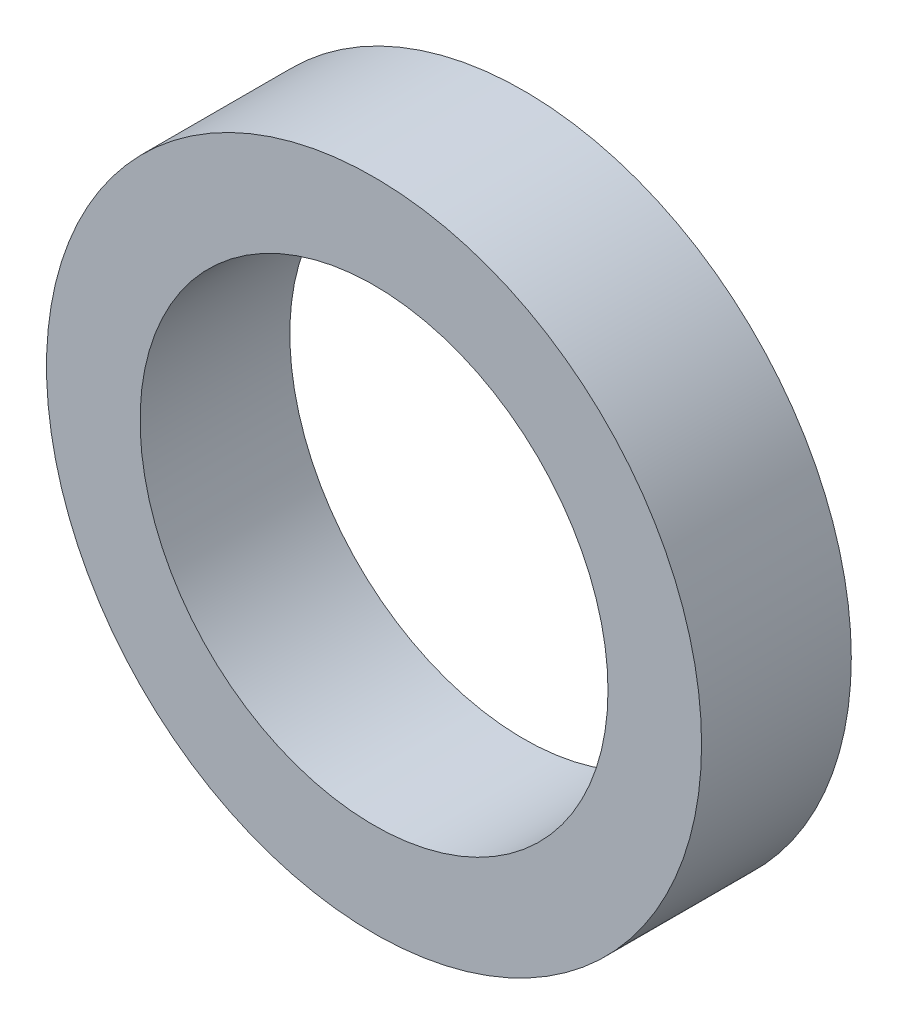
ISO-10303-21;
HEADER;
FILE_DESCRIPTION(('STEP AP214'),'2;1');
FILE_NAME('part.step','',(''),(''),'','','');
FILE_SCHEMA(('AUTOMOTIVE_DESIGN { 1 0 10303 214 1 1 1 1 }'));
ENDSEC;
DATA;
#1=APPLICATION_CONTEXT('core data for automotive mechanical design processes');
#2=APPLICATION_PROTOCOL_DEFINITION('international standard','automotive_design',2000,#1);
#3=PRODUCT_CONTEXT('',#1,'mechanical');
#4=PRODUCT('Part','Part','',(#3));
#5=PRODUCT_RELATED_PRODUCT_CATEGORY('part','',(#4));
#6=PRODUCT_DEFINITION_FORMATION('','',#4);
#7=PRODUCT_DEFINITION_CONTEXT('part definition',#1,'design');
#8=PRODUCT_DEFINITION('design','',#6,#7);
#9=PRODUCT_DEFINITION_SHAPE('','',#8);
#10=(LENGTH_UNIT() NAMED_UNIT(*) SI_UNIT(.MILLI.,.METRE.));
#11=(NAMED_UNIT(*) PLANE_ANGLE_UNIT() SI_UNIT($,.RADIAN.));
#12=(NAMED_UNIT(*) SI_UNIT($,.STERADIAN.) SOLID_ANGLE_UNIT());
#13=UNCERTAINTY_MEASURE_WITH_UNIT(LENGTH_MEASURE(1.E-05),#10,'distance_accuracy_value','');
#14=(GEOMETRIC_REPRESENTATION_CONTEXT(3) GLOBAL_UNCERTAINTY_ASSIGNED_CONTEXT((#13)) GLOBAL_UNIT_ASSIGNED_CONTEXT((#10,
#11,#12)) REPRESENTATION_CONTEXT('',''));
#15=CARTESIAN_POINT('',(0.,0.,0.));
#16=DIRECTION('',(0.,0.,1.));
#17=DIRECTION('',(1.,0.,0.));
#18=AXIS2_PLACEMENT_3D('',#15,#16,#17);
#19=CARTESIAN_POINT('',(0.,0.,1.6));
#20=DIRECTION('',(0.,0.,1.));
#21=DIRECTION('',(1.,0.,0.));
#22=AXIS2_PLACEMENT_3D('',#19,#20,#21);
#23=PLANE('',#22);
#24=CARTESIAN_POINT('',(0.,0.,1.6));
#25=DIRECTION('',(0.,0.,1.));
#26=DIRECTION('',(1.,0.,0.));
#27=AXIS2_PLACEMENT_3D('',#24,#25,#26);
#28=CIRCLE('',#27,3.5);
#29=CARTESIAN_POINT('',(3.5,0.,1.6));
#30=VERTEX_POINT('',#29);
#31=EDGE_CURVE('E10',#30,#30,#28,.T.);
#32=ORIENTED_EDGE('',*,*,#31,.T.);
#33=EDGE_LOOP('',(#32));
#34=FACE_BOUND('',#33,.T.);
#35=CARTESIAN_POINT('',(0.,0.,1.6));
#36=DIRECTION('',(0.,0.,1.));
#37=DIRECTION('',(1.,0.,0.));
#38=AXIS2_PLACEMENT_3D('',#35,#36,#37);
#39=CIRCLE('',#38,2.5);
#40=CARTESIAN_POINT('',(2.5,0.,1.6));
#41=VERTEX_POINT('',#40);
#42=EDGE_CURVE('E56',#41,#41,#39,.T.);
#43=ORIENTED_EDGE('',*,*,#42,.F.);
#44=EDGE_LOOP('',(#43));
#45=FACE_BOUND('',#44,.T.);
#46=ADVANCED_FACE('F43',(#34,#45),#23,.T.);
#47=CARTESIAN_POINT('',(0.,0.,0.));
#48=DIRECTION('',(0.,0.,1.));
#49=DIRECTION('',(1.,0.,0.));
#50=AXIS2_PLACEMENT_3D('',#47,#48,#49);
#51=PLANE('',#50);
#52=CARTESIAN_POINT('',(0.,0.,0.));
#53=DIRECTION('',(0.,0.,1.));
#54=DIRECTION('',(1.,0.,0.));
#55=AXIS2_PLACEMENT_3D('',#52,#53,#54);
#56=CIRCLE('',#55,3.5);
#57=CARTESIAN_POINT('',(3.5,0.,0.));
#58=VERTEX_POINT('',#57);
#59=EDGE_CURVE('E47',#58,#58,#56,.T.);
#60=ORIENTED_EDGE('',*,*,#59,.F.);
#61=EDGE_LOOP('',(#60));
#62=FACE_BOUND('',#61,.T.);
#63=CARTESIAN_POINT('',(0.,0.,0.));
#64=DIRECTION('',(0.,0.,1.));
#65=DIRECTION('',(1.,0.,0.));
#66=AXIS2_PLACEMENT_3D('',#63,#64,#65);
#67=CIRCLE('',#66,2.5);
#68=CARTESIAN_POINT('',(2.5,0.,0.));
#69=VERTEX_POINT('',#68);
#70=EDGE_CURVE('E58',#69,#69,#67,.T.);
#71=ORIENTED_EDGE('',*,*,#70,.T.);
#72=EDGE_LOOP('',(#71));
#73=FACE_BOUND('',#72,.T.);
#74=ADVANCED_FACE('F70',(#62,#73),#51,.F.);
#75=CARTESIAN_POINT('',(0.,0.,1.6));
#76=DIRECTION('',(0.,0.,-1.));
#77=DIRECTION('',(-1.,0.,0.));
#78=AXIS2_PLACEMENT_3D('',#75,#76,#77);
#79=CYLINDRICAL_SURFACE('',#78,3.5);
#80=ORIENTED_EDGE('',*,*,#31,.F.);
#81=EDGE_LOOP('',(#80));
#82=FACE_BOUND('',#81,.T.);
#83=ORIENTED_EDGE('',*,*,#59,.T.);
#84=EDGE_LOOP('',(#83));
#85=FACE_BOUND('',#84,.T.);
#86=ADVANCED_FACE('F45',(#82,#85),#79,.T.);
#87=CARTESIAN_POINT('',(0.,0.,1.6));
#88=DIRECTION('',(0.,0.,-1.));
#89=DIRECTION('',(-1.,0.,0.));
#90=AXIS2_PLACEMENT_3D('',#87,#88,#89);
#91=CYLINDRICAL_SURFACE('',#90,2.5);
#92=ORIENTED_EDGE('',*,*,#42,.T.);
#93=EDGE_LOOP('',(#92));
#94=FACE_BOUND('',#93,.T.);
#95=ORIENTED_EDGE('',*,*,#70,.F.);
#96=EDGE_LOOP('',(#95));
#97=FACE_BOUND('',#96,.T.);
#98=ADVANCED_FACE('F66',(#94,#97),#91,.F.);
#99=CLOSED_SHELL('',(#46,#74,#86,#98));
#100=MANIFOLD_SOLID_BREP('B2',#99);
#101=ADVANCED_BREP_SHAPE_REPRESENTATION('',(#18,#100),#14);
#102=SHAPE_DEFINITION_REPRESENTATION(#9,#101);
ENDSEC;
END-ISO-10303-21;
